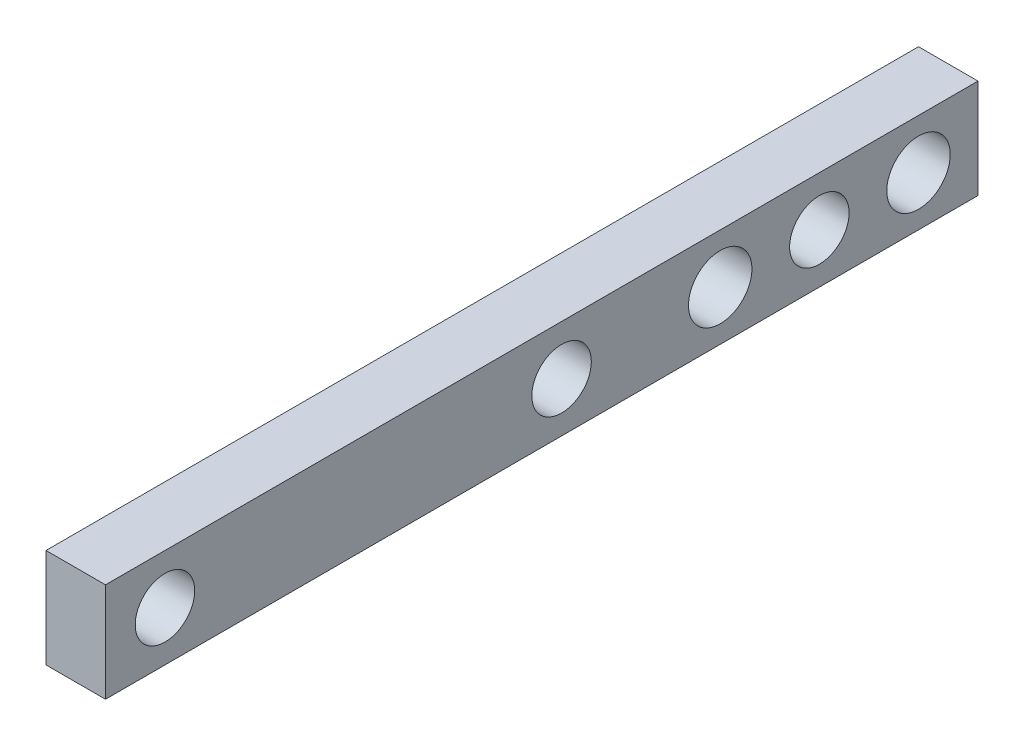
ISO-10303-21;
HEADER;
FILE_DESCRIPTION(('STEP AP214'),'2;1');
FILE_NAME('part.step','',(''),(''),'','','');
FILE_SCHEMA(('AUTOMOTIVE_DESIGN { 1 0 10303 214 1 1 1 1 }'));
ENDSEC;
DATA;
#1=APPLICATION_CONTEXT('core data for automotive mechanical design processes');
#2=APPLICATION_PROTOCOL_DEFINITION('international standard','automotive_design',2000,#1);
#3=PRODUCT_CONTEXT('',#1,'mechanical');
#4=PRODUCT('Part','Part','',(#3));
#5=PRODUCT_RELATED_PRODUCT_CATEGORY('part','',(#4));
#6=PRODUCT_DEFINITION_FORMATION('','',#4);
#7=PRODUCT_DEFINITION_CONTEXT('part definition',#1,'design');
#8=PRODUCT_DEFINITION('design','',#6,#7);
#9=PRODUCT_DEFINITION_SHAPE('','',#8);
#10=(LENGTH_UNIT() NAMED_UNIT(*) SI_UNIT(.MILLI.,.METRE.));
#11=(NAMED_UNIT(*) PLANE_ANGLE_UNIT() SI_UNIT($,.RADIAN.));
#12=(NAMED_UNIT(*) SI_UNIT($,.STERADIAN.) SOLID_ANGLE_UNIT());
#13=UNCERTAINTY_MEASURE_WITH_UNIT(LENGTH_MEASURE(1.E-05),#10,'distance_accuracy_value','');
#14=(GEOMETRIC_REPRESENTATION_CONTEXT(3) GLOBAL_UNCERTAINTY_ASSIGNED_CONTEXT((#13)) GLOBAL_UNIT_ASSIGNED_CONTEXT((#10,
#11,#12)) REPRESENTATION_CONTEXT('',''));
#15=CARTESIAN_POINT('',(0.,0.,0.));
#16=DIRECTION('',(0.,0.,1.));
#17=DIRECTION('',(1.,0.,0.));
#18=AXIS2_PLACEMENT_3D('',#15,#16,#17);
#19=CARTESIAN_POINT('',(3.,0.,0.));
#20=DIRECTION('',(-1.,0.,0.));
#21=DIRECTION('',(0.,0.,1.));
#22=AXIS2_PLACEMENT_3D('',#19,#20,#21);
#23=PLANE('',#22);
#24=CARTESIAN_POINT('',(3.,0.,-14.));
#25=DIRECTION('',(1.,0.,0.));
#26=DIRECTION('',(0.,0.,-1.));
#27=AXIS2_PLACEMENT_3D('',#24,#25,#26);
#28=CIRCLE('',#27,1.5);
#29=CARTESIAN_POINT('',(3.,0.,-15.5));
#30=VERTEX_POINT('',#29);
#31=EDGE_CURVE('E138',#30,#30,#28,.T.);
#32=ORIENTED_EDGE('',*,*,#31,.F.);
#33=EDGE_LOOP('',(#32));
#34=FACE_BOUND('',#33,.T.);
#35=DIRECTION('',(0.,1.,0.));
#36=VECTOR('',#35,1.);
#37=CARTESIAN_POINT('',(3.,-2.49999999999999,-22.));
#38=LINE('',#37,#36);
#39=CARTESIAN_POINT('',(3.,-2.49999999999999,-22.));
#40=VERTEX_POINT('',#39);
#41=CARTESIAN_POINT('',(3.,2.49999999999999,-22.));
#42=VERTEX_POINT('',#41);
#43=EDGE_CURVE('E87',#40,#42,#38,.T.);
#44=ORIENTED_EDGE('',*,*,#43,.T.);
#45=DIRECTION('',(0.,0.,1.));
#46=VECTOR('',#45,1.);
#47=CARTESIAN_POINT('',(3.,2.49999999999999,22.));
#48=LINE('',#47,#46);
#49=CARTESIAN_POINT('',(3.,2.49999999999999,22.));
#50=VERTEX_POINT('',#49);
#51=EDGE_CURVE('E82',#42,#50,#48,.T.);
#52=ORIENTED_EDGE('',*,*,#51,.T.);
#53=DIRECTION('',(0.,-1.,0.));
#54=VECTOR('',#53,1.);
#55=CARTESIAN_POINT('',(3.,-2.5,22.));
#56=LINE('',#55,#54);
#57=CARTESIAN_POINT('',(3.,-2.5,22.));
#58=VERTEX_POINT('',#57);
#59=EDGE_CURVE('E85',#50,#58,#56,.T.);
#60=ORIENTED_EDGE('',*,*,#59,.T.);
#61=DIRECTION('',(0.,0.,-1.));
#62=VECTOR('',#61,1.);
#63=CARTESIAN_POINT('',(3.,-2.5,22.));
#64=LINE('',#63,#62);
#65=EDGE_CURVE('E52',#58,#40,#64,.T.);
#66=ORIENTED_EDGE('',*,*,#65,.T.);
#67=EDGE_LOOP('',(#44,#52,#60,#66));
#68=FACE_BOUND('',#67,.T.);
#69=CARTESIAN_POINT('',(3.,0.,-19.));
#70=DIRECTION('',(1.,0.,0.));
#71=DIRECTION('',(0.,0.,-1.));
#72=AXIS2_PLACEMENT_3D('',#69,#70,#71);
#73=CIRCLE('',#72,1.6);
#74=CARTESIAN_POINT('',(3.,0.,-20.6));
#75=VERTEX_POINT('',#74);
#76=EDGE_CURVE('E102',#75,#75,#73,.T.);
#77=ORIENTED_EDGE('',*,*,#76,.F.);
#78=EDGE_LOOP('',(#77));
#79=FACE_BOUND('',#78,.T.);
#80=CARTESIAN_POINT('',(3.,0.,-9.));
#81=DIRECTION('',(1.,0.,0.));
#82=DIRECTION('',(0.,0.,-1.));
#83=AXIS2_PLACEMENT_3D('',#80,#81,#82);
#84=CIRCLE('',#83,1.6);
#85=CARTESIAN_POINT('',(3.,0.,-10.6));
#86=VERTEX_POINT('',#85);
#87=EDGE_CURVE('E117',#86,#86,#84,.T.);
#88=ORIENTED_EDGE('',*,*,#87,.F.);
#89=EDGE_LOOP('',(#88));
#90=FACE_BOUND('',#89,.T.);
#91=CARTESIAN_POINT('',(3.,0.,-0.999999999999999));
#92=DIRECTION('',(1.,0.,0.));
#93=DIRECTION('',(0.,0.,-1.));
#94=AXIS2_PLACEMENT_3D('',#91,#92,#93);
#95=CIRCLE('',#94,1.5);
#96=CARTESIAN_POINT('',(3.,0.,-2.5));
#97=VERTEX_POINT('',#96);
#98=EDGE_CURVE('E123',#97,#97,#95,.T.);
#99=ORIENTED_EDGE('',*,*,#98,.F.);
#100=EDGE_LOOP('',(#99));
#101=FACE_BOUND('',#100,.T.);
#102=CARTESIAN_POINT('',(3.,0.,19.));
#103=DIRECTION('',(1.,0.,0.));
#104=DIRECTION('',(0.,0.,-1.));
#105=AXIS2_PLACEMENT_3D('',#102,#103,#104);
#106=CIRCLE('',#105,1.5);
#107=CARTESIAN_POINT('',(3.,0.,17.5));
#108=VERTEX_POINT('',#107);
#109=EDGE_CURVE('E129',#108,#108,#106,.T.);
#110=ORIENTED_EDGE('',*,*,#109,.F.);
#111=EDGE_LOOP('',(#110));
#112=FACE_BOUND('',#111,.T.);
#113=ADVANCED_FACE('F35',(#34,#68,#79,#90,#101,#112),#23,.F.);
#114=CARTESIAN_POINT('',(0.,0.,0.));
#115=DIRECTION('',(-1.,0.,0.));
#116=DIRECTION('',(0.,0.,1.));
#117=AXIS2_PLACEMENT_3D('',#114,#115,#116);
#118=PLANE('',#117);
#119=CARTESIAN_POINT('',(0.,0.,-14.));
#120=DIRECTION('',(1.,0.,0.));
#121=DIRECTION('',(0.,0.,-1.));
#122=AXIS2_PLACEMENT_3D('',#119,#120,#121);
#123=CIRCLE('',#122,1.5);
#124=CARTESIAN_POINT('',(0.,0.,-15.5));
#125=VERTEX_POINT('',#124);
#126=EDGE_CURVE('E135',#125,#125,#123,.T.);
#127=ORIENTED_EDGE('',*,*,#126,.T.);
#128=EDGE_LOOP('',(#127));
#129=FACE_BOUND('',#128,.T.);
#130=CARTESIAN_POINT('',(0.,0.,-0.999999999999999));
#131=DIRECTION('',(1.,0.,0.));
#132=DIRECTION('',(0.,0.,-1.));
#133=AXIS2_PLACEMENT_3D('',#130,#131,#132);
#134=CIRCLE('',#133,1.5);
#135=CARTESIAN_POINT('',(0.,0.,-2.5));
#136=VERTEX_POINT('',#135);
#137=EDGE_CURVE('E126',#136,#136,#134,.T.);
#138=ORIENTED_EDGE('',*,*,#137,.T.);
#139=EDGE_LOOP('',(#138));
#140=FACE_BOUND('',#139,.T.);
#141=CARTESIAN_POINT('',(0.,0.,-19.));
#142=DIRECTION('',(1.,0.,0.));
#143=DIRECTION('',(0.,0.,-1.));
#144=AXIS2_PLACEMENT_3D('',#141,#142,#143);
#145=CIRCLE('',#144,1.6);
#146=CARTESIAN_POINT('',(0.,0.,-20.6));
#147=VERTEX_POINT('',#146);
#148=EDGE_CURVE('E114',#147,#147,#145,.T.);
#149=ORIENTED_EDGE('',*,*,#148,.T.);
#150=EDGE_LOOP('',(#149));
#151=FACE_BOUND('',#150,.T.);
#152=DIRECTION('',(0.,1.,0.));
#153=VECTOR('',#152,1.);
#154=CARTESIAN_POINT('',(0.,-2.49999999999999,-22.));
#155=LINE('',#154,#153);
#156=CARTESIAN_POINT('',(0.,-2.49999999999999,-22.));
#157=VERTEX_POINT('',#156);
#158=CARTESIAN_POINT('',(0.,2.49999999999999,-22.));
#159=VERTEX_POINT('',#158);
#160=EDGE_CURVE('E99',#157,#159,#155,.T.);
#161=ORIENTED_EDGE('',*,*,#160,.F.);
#162=DIRECTION('',(0.,0.,-1.));
#163=VECTOR('',#162,1.);
#164=CARTESIAN_POINT('',(0.,-2.5,22.));
#165=LINE('',#164,#163);
#166=CARTESIAN_POINT('',(0.,-2.5,22.));
#167=VERTEX_POINT('',#166);
#168=EDGE_CURVE('E75',#167,#157,#165,.T.);
#169=ORIENTED_EDGE('',*,*,#168,.F.);
#170=DIRECTION('',(0.,-1.,0.));
#171=VECTOR('',#170,1.);
#172=CARTESIAN_POINT('',(0.,-2.5,22.));
#173=LINE('',#172,#171);
#174=CARTESIAN_POINT('',(0.,2.49999999999999,22.));
#175=VERTEX_POINT('',#174);
#176=EDGE_CURVE('E69',#175,#167,#173,.T.);
#177=ORIENTED_EDGE('',*,*,#176,.F.);
#178=DIRECTION('',(0.,0.,1.));
#179=VECTOR('',#178,1.);
#180=CARTESIAN_POINT('',(0.,2.49999999999999,22.));
#181=LINE('',#180,#179);
#182=EDGE_CURVE('E91',#159,#175,#181,.T.);
#183=ORIENTED_EDGE('',*,*,#182,.F.);
#184=EDGE_LOOP('',(#161,#169,#177,#183));
#185=FACE_BOUND('',#184,.T.);
#186=CARTESIAN_POINT('',(0.,0.,-9.));
#187=DIRECTION('',(1.,0.,0.));
#188=DIRECTION('',(0.,0.,-1.));
#189=AXIS2_PLACEMENT_3D('',#186,#187,#188);
#190=CIRCLE('',#189,1.6);
#191=CARTESIAN_POINT('',(0.,0.,-10.6));
#192=VERTEX_POINT('',#191);
#193=EDGE_CURVE('E120',#192,#192,#190,.T.);
#194=ORIENTED_EDGE('',*,*,#193,.T.);
#195=EDGE_LOOP('',(#194));
#196=FACE_BOUND('',#195,.T.);
#197=CARTESIAN_POINT('',(0.,0.,19.));
#198=DIRECTION('',(1.,0.,0.));
#199=DIRECTION('',(0.,0.,-1.));
#200=AXIS2_PLACEMENT_3D('',#197,#198,#199);
#201=CIRCLE('',#200,1.5);
#202=CARTESIAN_POINT('',(0.,0.,17.5));
#203=VERTEX_POINT('',#202);
#204=EDGE_CURVE('E132',#203,#203,#201,.T.);
#205=ORIENTED_EDGE('',*,*,#204,.T.);
#206=EDGE_LOOP('',(#205));
#207=FACE_BOUND('',#206,.T.);
#208=ADVANCED_FACE('F110',(#129,#140,#151,#185,#196,#207),#118,.T.);
#209=CARTESIAN_POINT('',(3.,-2.49999999999999,-22.));
#210=DIRECTION('',(0.,0.,1.));
#211=DIRECTION('',(1.,0.,0.));
#212=AXIS2_PLACEMENT_3D('',#209,#210,#211);
#213=PLANE('',#212);
#214=ORIENTED_EDGE('',*,*,#160,.T.);
#215=DIRECTION('',(-1.,0.,0.));
#216=VECTOR('',#215,1.);
#217=CARTESIAN_POINT('',(3.,2.49999999999999,-22.));
#218=LINE('',#217,#216);
#219=EDGE_CURVE('E11',#42,#159,#218,.T.);
#220=ORIENTED_EDGE('',*,*,#219,.F.);
#221=ORIENTED_EDGE('',*,*,#43,.F.);
#222=DIRECTION('',(-1.,0.,0.));
#223=VECTOR('',#222,1.);
#224=CARTESIAN_POINT('',(3.,-2.49999999999999,-22.));
#225=LINE('',#224,#223);
#226=EDGE_CURVE('E95',#40,#157,#225,.T.);
#227=ORIENTED_EDGE('',*,*,#226,.T.);
#228=EDGE_LOOP('',(#214,#220,#221,#227));
#229=FACE_BOUND('',#228,.T.);
#230=ADVANCED_FACE('F37',(#229),#213,.F.);
#231=CARTESIAN_POINT('',(3.,2.49999999999999,22.));
#232=DIRECTION('',(0.,-1.,0.));
#233=DIRECTION('',(0.,0.,-1.));
#234=AXIS2_PLACEMENT_3D('',#231,#232,#233);
#235=PLANE('',#234);
#236=ORIENTED_EDGE('',*,*,#182,.T.);
#237=DIRECTION('',(-1.,0.,0.));
#238=VECTOR('',#237,1.);
#239=CARTESIAN_POINT('',(3.,2.49999999999999,22.));
#240=LINE('',#239,#238);
#241=EDGE_CURVE('E44',#50,#175,#240,.T.);
#242=ORIENTED_EDGE('',*,*,#241,.F.);
#243=ORIENTED_EDGE('',*,*,#51,.F.);
#244=ORIENTED_EDGE('',*,*,#219,.T.);
#245=EDGE_LOOP('',(#236,#242,#243,#244));
#246=FACE_BOUND('',#245,.T.);
#247=ADVANCED_FACE('F90',(#246),#235,.F.);
#248=CARTESIAN_POINT('',(3.,-2.5,22.));
#249=DIRECTION('',(0.,0.,-1.));
#250=DIRECTION('',(-1.,0.,0.));
#251=AXIS2_PLACEMENT_3D('',#248,#249,#250);
#252=PLANE('',#251);
#253=ORIENTED_EDGE('',*,*,#176,.T.);
#254=DIRECTION('',(-1.,0.,0.));
#255=VECTOR('',#254,1.);
#256=CARTESIAN_POINT('',(3.,-2.5,22.));
#257=LINE('',#256,#255);
#258=EDGE_CURVE('E92',#58,#167,#257,.T.);
#259=ORIENTED_EDGE('',*,*,#258,.F.);
#260=ORIENTED_EDGE('',*,*,#59,.F.);
#261=ORIENTED_EDGE('',*,*,#241,.T.);
#262=EDGE_LOOP('',(#253,#259,#260,#261));
#263=FACE_BOUND('',#262,.T.);
#264=ADVANCED_FACE('F93',(#263),#252,.F.);
#265=CARTESIAN_POINT('',(3.,-2.5,22.));
#266=DIRECTION('',(0.,1.,0.));
#267=DIRECTION('',(0.,0.,1.));
#268=AXIS2_PLACEMENT_3D('',#265,#266,#267);
#269=PLANE('',#268);
#270=ORIENTED_EDGE('',*,*,#168,.T.);
#271=ORIENTED_EDGE('',*,*,#226,.F.);
#272=ORIENTED_EDGE('',*,*,#65,.F.);
#273=ORIENTED_EDGE('',*,*,#258,.T.);
#274=EDGE_LOOP('',(#270,#271,#272,#273));
#275=FACE_BOUND('',#274,.T.);
#276=ADVANCED_FACE('F107',(#275),#269,.F.);
#277=CARTESIAN_POINT('',(3.,0.,-19.));
#278=DIRECTION('',(-1.,0.,0.));
#279=DIRECTION('',(0.,0.,1.));
#280=AXIS2_PLACEMENT_3D('',#277,#278,#279);
#281=CYLINDRICAL_SURFACE('',#280,1.6);
#282=ORIENTED_EDGE('',*,*,#76,.T.);
#283=EDGE_LOOP('',(#282));
#284=FACE_BOUND('',#283,.T.);
#285=ORIENTED_EDGE('',*,*,#148,.F.);
#286=EDGE_LOOP('',(#285));
#287=FACE_BOUND('',#286,.T.);
#288=ADVANCED_FACE('F161',(#284,#287),#281,.F.);
#289=CARTESIAN_POINT('',(3.,0.,-9.));
#290=DIRECTION('',(-1.,0.,0.));
#291=DIRECTION('',(0.,0.,1.));
#292=AXIS2_PLACEMENT_3D('',#289,#290,#291);
#293=CYLINDRICAL_SURFACE('',#292,1.6);
#294=ORIENTED_EDGE('',*,*,#87,.T.);
#295=EDGE_LOOP('',(#294));
#296=FACE_BOUND('',#295,.T.);
#297=ORIENTED_EDGE('',*,*,#193,.F.);
#298=EDGE_LOOP('',(#297));
#299=FACE_BOUND('',#298,.T.);
#300=ADVANCED_FACE('F202',(#296,#299),#293,.F.);
#301=CARTESIAN_POINT('',(3.,0.,-0.999999999999999));
#302=DIRECTION('',(-1.,0.,0.));
#303=DIRECTION('',(0.,0.,1.));
#304=AXIS2_PLACEMENT_3D('',#301,#302,#303);
#305=CYLINDRICAL_SURFACE('',#304,1.5);
#306=ORIENTED_EDGE('',*,*,#98,.T.);
#307=EDGE_LOOP('',(#306));
#308=FACE_BOUND('',#307,.T.);
#309=ORIENTED_EDGE('',*,*,#137,.F.);
#310=EDGE_LOOP('',(#309));
#311=FACE_BOUND('',#310,.T.);
#312=ADVANCED_FACE('F195',(#308,#311),#305,.F.);
#313=CARTESIAN_POINT('',(3.,0.,19.));
#314=DIRECTION('',(-1.,0.,0.));
#315=DIRECTION('',(0.,0.,1.));
#316=AXIS2_PLACEMENT_3D('',#313,#314,#315);
#317=CYLINDRICAL_SURFACE('',#316,1.5);
#318=ORIENTED_EDGE('',*,*,#109,.T.);
#319=EDGE_LOOP('',(#318));
#320=FACE_BOUND('',#319,.T.);
#321=ORIENTED_EDGE('',*,*,#204,.F.);
#322=EDGE_LOOP('',(#321));
#323=FACE_BOUND('',#322,.T.);
#324=ADVANCED_FACE('F149',(#320,#323),#317,.F.);
#325=CARTESIAN_POINT('',(0.,0.,-14.));
#326=DIRECTION('',(1.,0.,0.));
#327=DIRECTION('',(0.,0.,-1.));
#328=AXIS2_PLACEMENT_3D('',#325,#326,#327);
#329=CYLINDRICAL_SURFACE('',#328,1.5);
#330=ORIENTED_EDGE('',*,*,#126,.F.);
#331=EDGE_LOOP('',(#330));
#332=FACE_BOUND('',#331,.T.);
#333=ORIENTED_EDGE('',*,*,#31,.T.);
#334=EDGE_LOOP('',(#333));
#335=FACE_BOUND('',#334,.T.);
#336=ADVANCED_FACE('F146',(#332,#335),#329,.F.);
#337=CLOSED_SHELL('',(#113,#208,#230,#247,#264,#276,#288,#300,#312,#324,#336));
#338=MANIFOLD_SOLID_BREP('B2',#337);
#339=ADVANCED_BREP_SHAPE_REPRESENTATION('',(#18,#338),#14);
#340=SHAPE_DEFINITION_REPRESENTATION(#9,#339);
ENDSEC;
END-ISO-10303-21;
